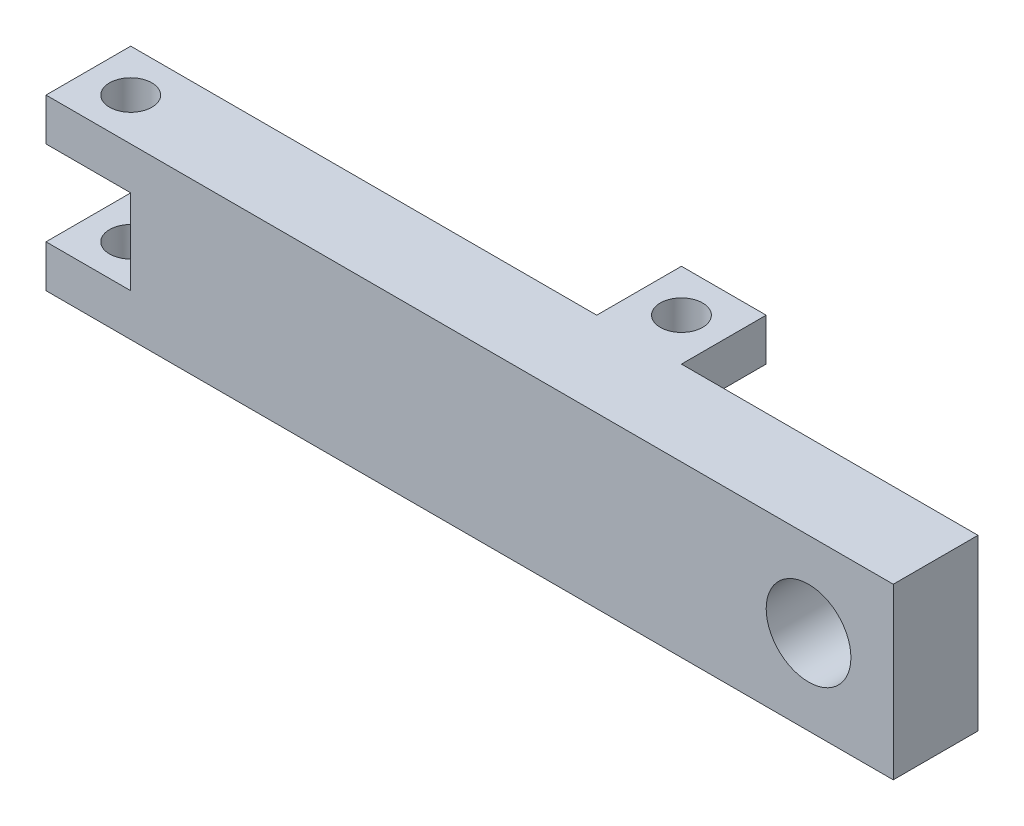
ISO-10303-21;
HEADER;
FILE_DESCRIPTION(('STEP AP214'),'2;1');
FILE_NAME('part.step','',(''),(''),'','','');
FILE_SCHEMA(('AUTOMOTIVE_DESIGN { 1 0 10303 214 1 1 1 1 }'));
ENDSEC;
DATA;
#1=APPLICATION_CONTEXT('core data for automotive mechanical design processes');
#2=APPLICATION_PROTOCOL_DEFINITION('international standard','automotive_design',2000,#1);
#3=PRODUCT_CONTEXT('',#1,'mechanical');
#4=PRODUCT('Part','Part','',(#3));
#5=PRODUCT_RELATED_PRODUCT_CATEGORY('part','',(#4));
#6=PRODUCT_DEFINITION_FORMATION('','',#4);
#7=PRODUCT_DEFINITION_CONTEXT('part definition',#1,'design');
#8=PRODUCT_DEFINITION('design','',#6,#7);
#9=PRODUCT_DEFINITION_SHAPE('','',#8);
#10=(LENGTH_UNIT() NAMED_UNIT(*) SI_UNIT(.MILLI.,.METRE.));
#11=(NAMED_UNIT(*) PLANE_ANGLE_UNIT() SI_UNIT($,.RADIAN.));
#12=(NAMED_UNIT(*) SI_UNIT($,.STERADIAN.) SOLID_ANGLE_UNIT());
#13=UNCERTAINTY_MEASURE_WITH_UNIT(LENGTH_MEASURE(1.E-05),#10,'distance_accuracy_value','');
#14=(GEOMETRIC_REPRESENTATION_CONTEXT(3) GLOBAL_UNCERTAINTY_ASSIGNED_CONTEXT((#13)) GLOBAL_UNIT_ASSIGNED_CONTEXT((#10,
#11,#12)) REPRESENTATION_CONTEXT('',''));
#15=CARTESIAN_POINT('',(0.,0.,0.));
#16=DIRECTION('',(0.,0.,1.));
#17=DIRECTION('',(1.,0.,0.));
#18=AXIS2_PLACEMENT_3D('',#15,#16,#17);
#19=CARTESIAN_POINT('',(-5.,-20.,0.));
#20=DIRECTION('',(-1.,0.,0.));
#21=DIRECTION('',(0.,0.,1.));
#22=AXIS2_PLACEMENT_3D('',#19,#20,#21);
#23=PLANE('',#22);
#24=DIRECTION('',(0.,0.,-1.));
#25=VECTOR('',#24,1.);
#26=CARTESIAN_POINT('',(-5.00000000000001,-15.,9.14213562373095));
#27=LINE('',#26,#25);
#28=CARTESIAN_POINT('',(-5.,-15.,-5.));
#29=VERTEX_POINT('',#28);
#30=CARTESIAN_POINT('',(-5.,-15.,-15.));
#31=VERTEX_POINT('',#30);
#32=EDGE_CURVE('E152',#29,#31,#27,.T.);
#33=ORIENTED_EDGE('',*,*,#32,.T.);
#34=DIRECTION('',(0.,1.,0.));
#35=VECTOR('',#34,1.);
#36=CARTESIAN_POINT('',(-5.,-20.,-15.));
#37=LINE('',#36,#35);
#38=CARTESIAN_POINT('',(-5.,-20.,-15.));
#39=VERTEX_POINT('',#38);
#40=EDGE_CURVE('E184',#39,#31,#37,.T.);
#41=ORIENTED_EDGE('',*,*,#40,.F.);
#42=DIRECTION('',(0.,0.,1.));
#43=VECTOR('',#42,1.);
#44=CARTESIAN_POINT('',(-5.,-20.,0.));
#45=LINE('',#44,#43);
#46=CARTESIAN_POINT('',(-5.,-20.,-5.));
#47=VERTEX_POINT('',#46);
#48=EDGE_CURVE('E178',#39,#47,#45,.T.);
#49=ORIENTED_EDGE('',*,*,#48,.T.);
#50=DIRECTION('',(0.,1.,0.));
#51=VECTOR('',#50,1.);
#52=CARTESIAN_POINT('',(-5.,-20.,-5.));
#53=LINE('',#52,#51);
#54=EDGE_CURVE('E170',#47,#29,#53,.T.);
#55=ORIENTED_EDGE('',*,*,#54,.T.);
#56=EDGE_LOOP('',(#33,#41,#49,#55));
#57=FACE_BOUND('',#56,.T.);
#58=ADVANCED_FACE('F39',(#57),#23,.T.);
#59=CARTESIAN_POINT('',(0.,-20.,-15.));
#60=DIRECTION('',(0.,0.,1.));
#61=DIRECTION('',(1.,0.,0.));
#62=AXIS2_PLACEMENT_3D('',#59,#60,#61);
#63=PLANE('',#62);
#64=ORIENTED_EDGE('',*,*,#40,.T.);
#65=DIRECTION('',(-1.,0.,0.));
#66=VECTOR('',#65,1.);
#67=CARTESIAN_POINT('',(5.,-15.,-15.));
#68=LINE('',#67,#66);
#69=CARTESIAN_POINT('',(5.,-15.,-15.));
#70=VERTEX_POINT('',#69);
#71=EDGE_CURVE('E159',#70,#31,#68,.T.);
#72=ORIENTED_EDGE('',*,*,#71,.F.);
#73=DIRECTION('',(0.,1.,0.));
#74=VECTOR('',#73,1.);
#75=CARTESIAN_POINT('',(5.,-20.,-15.));
#76=LINE('',#75,#74);
#77=CARTESIAN_POINT('',(5.,-20.,-15.));
#78=VERTEX_POINT('',#77);
#79=EDGE_CURVE('E189',#78,#70,#76,.T.);
#80=ORIENTED_EDGE('',*,*,#79,.F.);
#81=DIRECTION('',(1.,0.,0.));
#82=VECTOR('',#81,1.);
#83=CARTESIAN_POINT('',(0.,-20.,-15.));
#84=LINE('',#83,#82);
#85=EDGE_CURVE('E250',#39,#78,#84,.T.);
#86=ORIENTED_EDGE('',*,*,#85,.F.);
#87=EDGE_LOOP('',(#64,#72,#80,#86));
#88=FACE_BOUND('',#87,.T.);
#89=ADVANCED_FACE('F360',(#88),#63,.F.);
#90=CARTESIAN_POINT('',(5.,-20.,0.));
#91=DIRECTION('',(-1.,0.,0.));
#92=DIRECTION('',(0.,0.,1.));
#93=AXIS2_PLACEMENT_3D('',#90,#91,#92);
#94=PLANE('',#93);
#95=ORIENTED_EDGE('',*,*,#79,.T.);
#96=DIRECTION('',(0.,0.,-1.));
#97=VECTOR('',#96,1.);
#98=CARTESIAN_POINT('',(5.,-15.,9.14213562373095));
#99=LINE('',#98,#97);
#100=CARTESIAN_POINT('',(5.,-15.,-5.));
#101=VERTEX_POINT('',#100);
#102=EDGE_CURVE('E208',#101,#70,#99,.T.);
#103=ORIENTED_EDGE('',*,*,#102,.F.);
#104=DIRECTION('',(0.,1.,0.));
#105=VECTOR('',#104,1.);
#106=CARTESIAN_POINT('',(5.,-20.,-5.));
#107=LINE('',#106,#105);
#108=CARTESIAN_POINT('',(5.,-20.,-5.));
#109=VERTEX_POINT('',#108);
#110=EDGE_CURVE('E174',#109,#101,#107,.T.);
#111=ORIENTED_EDGE('',*,*,#110,.F.);
#112=DIRECTION('',(0.,0.,1.));
#113=VECTOR('',#112,1.);
#114=CARTESIAN_POINT('',(5.,-20.,0.));
#115=LINE('',#114,#113);
#116=EDGE_CURVE('E247',#78,#109,#115,.T.);
#117=ORIENTED_EDGE('',*,*,#116,.F.);
#118=EDGE_LOOP('',(#95,#103,#111,#117));
#119=FACE_BOUND('',#118,.T.);
#120=ADVANCED_FACE('F364',(#119),#94,.F.);
#121=CARTESIAN_POINT('',(0.,-20.,-10.));
#122=DIRECTION('',(0.,1.,0.));
#123=DIRECTION('',(0.,0.,1.));
#124=AXIS2_PLACEMENT_3D('',#121,#122,#123);
#125=CYLINDRICAL_SURFACE('',#124,2.5);
#126=CARTESIAN_POINT('',(0.,-15.,-10.));
#127=DIRECTION('',(0.,-1.,0.));
#128=DIRECTION('',(0.,0.,-1.));
#129=AXIS2_PLACEMENT_3D('',#126,#127,#128);
#130=CIRCLE('',#129,2.5);
#131=CARTESIAN_POINT('',(0.,-15.,-12.5));
#132=VERTEX_POINT('',#131);
#133=EDGE_CURVE('E43',#132,#132,#130,.F.);
#134=ORIENTED_EDGE('',*,*,#133,.T.);
#135=EDGE_LOOP('',(#134));
#136=FACE_BOUND('',#135,.T.);
#137=CARTESIAN_POINT('',(0.,-20.,-10.));
#138=DIRECTION('',(0.,1.,0.));
#139=DIRECTION('',(0.,0.,1.));
#140=AXIS2_PLACEMENT_3D('',#137,#138,#139);
#141=CIRCLE('',#140,2.5);
#142=CARTESIAN_POINT('',(0.,-20.,-7.5));
#143=VERTEX_POINT('',#142);
#144=EDGE_CURVE('E198',#143,#143,#141,.T.);
#145=ORIENTED_EDGE('',*,*,#144,.F.);
#146=EDGE_LOOP('',(#145));
#147=FACE_BOUND('',#146,.T.);
#148=ADVANCED_FACE('F382',(#136,#147),#125,.F.);
#149=CARTESIAN_POINT('',(-60.,-20.,0.));
#150=DIRECTION('',(-1.,0.,0.));
#151=DIRECTION('',(0.,0.,1.));
#152=AXIS2_PLACEMENT_3D('',#149,#150,#151);
#153=PLANE('',#152);
#154=DIRECTION('',(0.,0.,1.));
#155=VECTOR('',#154,1.);
#156=CARTESIAN_POINT('',(-60.,-15.,-4.99999999999996));
#157=LINE('',#156,#155);
#158=CARTESIAN_POINT('',(-60.,-15.,-4.99999999999996));
#159=VERTEX_POINT('',#158);
#160=CARTESIAN_POINT('',(-60.,-15.,5.00000000000004));
#161=VERTEX_POINT('',#160);
#162=EDGE_CURVE('E221',#159,#161,#157,.T.);
#163=ORIENTED_EDGE('',*,*,#162,.F.);
#164=DIRECTION('',(0.,1.,0.));
#165=VECTOR('',#164,1.);
#166=CARTESIAN_POINT('',(-60.,-20.,-5.00000000000001));
#167=LINE('',#166,#165);
#168=CARTESIAN_POINT('',(-60.,-20.,-5.00000000000001));
#169=VERTEX_POINT('',#168);
#170=EDGE_CURVE('E182',#169,#159,#167,.T.);
#171=ORIENTED_EDGE('',*,*,#170,.F.);
#172=DIRECTION('',(0.,0.,1.));
#173=VECTOR('',#172,1.);
#174=CARTESIAN_POINT('',(-60.,-20.,0.));
#175=LINE('',#174,#173);
#176=CARTESIAN_POINT('',(-60.,-20.,4.99999999999999));
#177=VERTEX_POINT('',#176);
#178=EDGE_CURVE('E253',#169,#177,#175,.T.);
#179=ORIENTED_EDGE('',*,*,#178,.T.);
#180=DIRECTION('',(0.,1.,0.));
#181=VECTOR('',#180,1.);
#182=CARTESIAN_POINT('',(-60.,-20.,4.99999999999999));
#183=LINE('',#182,#181);
#184=EDGE_CURVE('E48',#177,#161,#183,.T.);
#185=ORIENTED_EDGE('',*,*,#184,.T.);
#186=EDGE_LOOP('',(#163,#171,#179,#185));
#187=FACE_BOUND('',#186,.T.);
#188=ADVANCED_FACE('F296',(#187),#153,.T.);
#189=CARTESIAN_POINT('',(-55.,-20.,0.));
#190=DIRECTION('',(0.,1.,0.));
#191=DIRECTION('',(0.,0.,1.));
#192=AXIS2_PLACEMENT_3D('',#189,#190,#191);
#193=CYLINDRICAL_SURFACE('',#192,2.5);
#194=CARTESIAN_POINT('',(-55.,-15.,0.));
#195=DIRECTION('',(0.,-1.,0.));
#196=DIRECTION('',(0.,0.,-1.));
#197=AXIS2_PLACEMENT_3D('',#194,#195,#196);
#198=CIRCLE('',#197,2.5);
#199=CARTESIAN_POINT('',(-55.,-15.,-2.50000000000001));
#200=VERTEX_POINT('',#199);
#201=EDGE_CURVE('E202',#200,#200,#198,.F.);
#202=ORIENTED_EDGE('',*,*,#201,.T.);
#203=EDGE_LOOP('',(#202));
#204=FACE_BOUND('',#203,.T.);
#205=CARTESIAN_POINT('',(-55.,-20.,0.));
#206=DIRECTION('',(0.,1.,0.));
#207=DIRECTION('',(0.,0.,1.));
#208=AXIS2_PLACEMENT_3D('',#205,#206,#207);
#209=CIRCLE('',#208,2.5);
#210=CARTESIAN_POINT('',(-55.,-20.,2.49999999999999));
#211=VERTEX_POINT('',#210);
#212=EDGE_CURVE('E239',#211,#211,#209,.T.);
#213=ORIENTED_EDGE('',*,*,#212,.F.);
#214=EDGE_LOOP('',(#213));
#215=FACE_BOUND('',#214,.T.);
#216=ADVANCED_FACE('F371',(#204,#215),#193,.F.);
#217=CARTESIAN_POINT('',(40.,-20.,0.));
#218=DIRECTION('',(-1.,0.,0.));
#219=DIRECTION('',(0.,0.,1.));
#220=AXIS2_PLACEMENT_3D('',#217,#218,#219);
#221=PLANE('',#220);
#222=DIRECTION('',(0.,0.,1.));
#223=VECTOR('',#222,1.);
#224=CARTESIAN_POINT('',(40.,0.,0.));
#225=LINE('',#224,#223);
#226=CARTESIAN_POINT('',(40.,0.,-4.99999999999999));
#227=VERTEX_POINT('',#226);
#228=CARTESIAN_POINT('',(40.,0.,5.00000000000001));
#229=VERTEX_POINT('',#228);
#230=EDGE_CURVE('E263',#227,#229,#225,.T.);
#231=ORIENTED_EDGE('',*,*,#230,.T.);
#232=DIRECTION('',(0.,1.,0.));
#233=VECTOR('',#232,1.);
#234=CARTESIAN_POINT('',(40.,-20.,5.00000000000001));
#235=LINE('',#234,#233);
#236=CARTESIAN_POINT('',(40.,-20.,5.00000000000001));
#237=VERTEX_POINT('',#236);
#238=EDGE_CURVE('E11',#237,#229,#235,.T.);
#239=ORIENTED_EDGE('',*,*,#238,.F.);
#240=DIRECTION('',(0.,0.,1.));
#241=VECTOR('',#240,1.);
#242=CARTESIAN_POINT('',(40.,-20.,0.));
#243=LINE('',#242,#241);
#244=CARTESIAN_POINT('',(40.,-20.,-4.99999999999999));
#245=VERTEX_POINT('',#244);
#246=EDGE_CURVE('E242',#245,#237,#243,.T.);
#247=ORIENTED_EDGE('',*,*,#246,.F.);
#248=DIRECTION('',(0.,1.,0.));
#249=VECTOR('',#248,1.);
#250=CARTESIAN_POINT('',(40.,-20.,-4.99999999999999));
#251=LINE('',#250,#249);
#252=EDGE_CURVE('E195',#245,#227,#251,.T.);
#253=ORIENTED_EDGE('',*,*,#252,.T.);
#254=EDGE_LOOP('',(#231,#239,#247,#253));
#255=FACE_BOUND('',#254,.T.);
#256=ADVANCED_FACE('F320',(#255),#221,.F.);
#257=CARTESIAN_POINT('',(0.,-20.,5.));
#258=DIRECTION('',(0.,0.,1.));
#259=DIRECTION('',(1.,0.,0.));
#260=AXIS2_PLACEMENT_3D('',#257,#258,#259);
#261=PLANE('',#260);
#262=CARTESIAN_POINT('',(30.,-10.,5.00000000000001));
#263=DIRECTION('',(0.,0.,1.));
#264=DIRECTION('',(1.,0.,0.));
#265=AXIS2_PLACEMENT_3D('',#262,#263,#264);
#266=CIRCLE('',#265,5.);
#267=CARTESIAN_POINT('',(35.,-10.,5.00000000000001));
#268=VERTEX_POINT('',#267);
#269=EDGE_CURVE('E343',#268,#268,#266,.F.);
#270=ORIENTED_EDGE('',*,*,#269,.T.);
#271=EDGE_LOOP('',(#270));
#272=FACE_BOUND('',#271,.T.);
#273=DIRECTION('',(-1.,0.,0.));
#274=VECTOR('',#273,1.);
#275=CARTESIAN_POINT('',(-50.,-15.,5.00000000000004));
#276=LINE('',#275,#274);
#277=CARTESIAN_POINT('',(-50.,-15.,5.00000000000004));
#278=VERTEX_POINT('',#277);
#279=EDGE_CURVE('E203',#278,#161,#276,.T.);
#280=ORIENTED_EDGE('',*,*,#279,.T.);
#281=ORIENTED_EDGE('',*,*,#184,.F.);
#282=DIRECTION('',(1.,0.,0.));
#283=VECTOR('',#282,1.);
#284=CARTESIAN_POINT('',(0.,-20.,5.));
#285=LINE('',#284,#283);
#286=EDGE_CURVE('E256',#177,#237,#285,.T.);
#287=ORIENTED_EDGE('',*,*,#286,.T.);
#288=ORIENTED_EDGE('',*,*,#238,.T.);
#289=DIRECTION('',(1.,0.,0.));
#290=VECTOR('',#289,1.);
#291=CARTESIAN_POINT('',(0.,0.,5.));
#292=LINE('',#291,#290);
#293=CARTESIAN_POINT('',(-60.,0.,4.99999999999999));
#294=VERTEX_POINT('',#293);
#295=EDGE_CURVE('E281',#294,#229,#292,.T.);
#296=ORIENTED_EDGE('',*,*,#295,.F.);
#297=CARTESIAN_POINT('',(-60.,-5.,5.00000000000004));
#298=VERTEX_POINT('',#297);
#299=EDGE_CURVE('E286',#298,#294,#183,.T.);
#300=ORIENTED_EDGE('',*,*,#299,.F.);
#301=DIRECTION('',(-1.,0.,0.));
#302=VECTOR('',#301,1.);
#303=CARTESIAN_POINT('',(-50.,-5.,5.00000000000004));
#304=LINE('',#303,#302);
#305=CARTESIAN_POINT('',(-50.,-5.,5.00000000000004));
#306=VERTEX_POINT('',#305);
#307=EDGE_CURVE('E228',#306,#298,#304,.T.);
#308=ORIENTED_EDGE('',*,*,#307,.F.);
#309=DIRECTION('',(0.,1.,0.));
#310=VECTOR('',#309,1.);
#311=CARTESIAN_POINT('',(-50.,-5.,5.00000000000004));
#312=LINE('',#311,#310);
#313=EDGE_CURVE('E219',#278,#306,#312,.T.);
#314=ORIENTED_EDGE('',*,*,#313,.F.);
#315=EDGE_LOOP('',(#280,#281,#287,#288,#296,#300,#308,#314));
#316=FACE_BOUND('',#315,.T.);
#317=ADVANCED_FACE('F304',(#272,#316),#261,.T.);
#318=DIRECTION('',(0.,0.,-1.));
#319=VECTOR('',#318,1.);
#320=CARTESIAN_POINT('',(-60.,-5.,-4.99999999999996));
#321=LINE('',#320,#319);
#322=CARTESIAN_POINT('',(-60.,-5.,-4.99999999999996));
#323=VERTEX_POINT('',#322);
#324=EDGE_CURVE('E212',#298,#323,#321,.T.);
#325=ORIENTED_EDGE('',*,*,#324,.F.);
#326=ORIENTED_EDGE('',*,*,#299,.T.);
#327=DIRECTION('',(0.,0.,1.));
#328=VECTOR('',#327,1.);
#329=CARTESIAN_POINT('',(-60.,0.,0.));
#330=LINE('',#329,#328);
#331=CARTESIAN_POINT('',(-60.,0.,-5.00000000000001));
#332=VERTEX_POINT('',#331);
#333=EDGE_CURVE('E278',#332,#294,#330,.T.);
#334=ORIENTED_EDGE('',*,*,#333,.F.);
#335=EDGE_CURVE('E179',#323,#332,#167,.T.);
#336=ORIENTED_EDGE('',*,*,#335,.F.);
#337=EDGE_LOOP('',(#325,#326,#334,#336));
#338=FACE_BOUND('',#337,.T.);
#339=ADVANCED_FACE('F311',(#338),#153,.T.);
#340=CARTESIAN_POINT('',(0.,-20.,-5.));
#341=DIRECTION('',(0.,0.,1.));
#342=DIRECTION('',(1.,0.,0.));
#343=AXIS2_PLACEMENT_3D('',#340,#341,#342);
#344=PLANE('',#343);
#345=CARTESIAN_POINT('',(30.,-10.,-4.99999999999999));
#346=DIRECTION('',(0.,0.,-1.));
#347=DIRECTION('',(-1.,0.,0.));
#348=AXIS2_PLACEMENT_3D('',#345,#346,#347);
#349=CIRCLE('',#348,5.);
#350=CARTESIAN_POINT('',(25.,-10.,-4.99999999999999));
#351=VERTEX_POINT('',#350);
#352=EDGE_CURVE('E341',#351,#351,#349,.T.);
#353=ORIENTED_EDGE('',*,*,#352,.F.);
#354=EDGE_LOOP('',(#353));
#355=FACE_BOUND('',#354,.T.);
#356=ORIENTED_EDGE('',*,*,#170,.T.);
#357=DIRECTION('',(-1.,0.,0.));
#358=VECTOR('',#357,1.);
#359=CARTESIAN_POINT('',(-50.,-15.,-4.99999999999996));
#360=LINE('',#359,#358);
#361=CARTESIAN_POINT('',(-50.,-15.,-4.99999999999996));
#362=VERTEX_POINT('',#361);
#363=EDGE_CURVE('E233',#362,#159,#360,.T.);
#364=ORIENTED_EDGE('',*,*,#363,.F.);
#365=DIRECTION('',(0.,-1.,0.));
#366=VECTOR('',#365,1.);
#367=CARTESIAN_POINT('',(-50.,-5.,-4.99999999999996));
#368=LINE('',#367,#366);
#369=CARTESIAN_POINT('',(-50.,-5.,-5.00000000000001));
#370=VERTEX_POINT('',#369);
#371=EDGE_CURVE('E223',#370,#362,#368,.T.);
#372=ORIENTED_EDGE('',*,*,#371,.F.);
#373=DIRECTION('',(-1.,0.,0.));
#374=VECTOR('',#373,1.);
#375=CARTESIAN_POINT('',(-50.,-5.,-4.99999999999996));
#376=LINE('',#375,#374);
#377=EDGE_CURVE('E235',#370,#323,#376,.T.);
#378=ORIENTED_EDGE('',*,*,#377,.T.);
#379=ORIENTED_EDGE('',*,*,#335,.T.);
#380=DIRECTION('',(1.,0.,0.));
#381=VECTOR('',#380,1.);
#382=CARTESIAN_POINT('',(0.,0.,-5.));
#383=LINE('',#382,#381);
#384=CARTESIAN_POINT('',(-5.,0.,-5.));
#385=VERTEX_POINT('',#384);
#386=EDGE_CURVE('E269',#332,#385,#383,.T.);
#387=ORIENTED_EDGE('',*,*,#386,.T.);
#388=CARTESIAN_POINT('',(-5.,-5.,-5.));
#389=VERTEX_POINT('',#388);
#390=EDGE_CURVE('E180',#389,#385,#53,.T.);
#391=ORIENTED_EDGE('',*,*,#390,.F.);
#392=DIRECTION('',(1.,0.,0.));
#393=VECTOR('',#392,1.);
#394=CARTESIAN_POINT('',(5.,-5.,-5.));
#395=LINE('',#394,#393);
#396=CARTESIAN_POINT('',(5.,-5.,-5.));
#397=VERTEX_POINT('',#396);
#398=EDGE_CURVE('E56',#389,#397,#395,.T.);
#399=ORIENTED_EDGE('',*,*,#398,.T.);
#400=CARTESIAN_POINT('',(5.,0.,-5.));
#401=VERTEX_POINT('',#400);
#402=EDGE_CURVE('E194',#397,#401,#107,.T.);
#403=ORIENTED_EDGE('',*,*,#402,.T.);
#404=EDGE_CURVE('E266',#401,#227,#383,.T.);
#405=ORIENTED_EDGE('',*,*,#404,.T.);
#406=ORIENTED_EDGE('',*,*,#252,.F.);
#407=DIRECTION('',(1.,0.,0.));
#408=VECTOR('',#407,1.);
#409=CARTESIAN_POINT('',(0.,-20.,-5.));
#410=LINE('',#409,#408);
#411=EDGE_CURVE('E245',#109,#245,#410,.T.);
#412=ORIENTED_EDGE('',*,*,#411,.F.);
#413=ORIENTED_EDGE('',*,*,#110,.T.);
#414=DIRECTION('',(-1.,0.,0.));
#415=VECTOR('',#414,1.);
#416=CARTESIAN_POINT('',(5.,-15.,-5.));
#417=LINE('',#416,#415);
#418=EDGE_CURVE('E156',#101,#29,#417,.T.);
#419=ORIENTED_EDGE('',*,*,#418,.T.);
#420=ORIENTED_EDGE('',*,*,#54,.F.);
#421=EDGE_CURVE('E248',#169,#47,#410,.T.);
#422=ORIENTED_EDGE('',*,*,#421,.F.);
#423=EDGE_LOOP('',(#356,#364,#372,#378,#379,#387,#391,#399,#403,#405,#406,#412,#413,#419,#420,#422));
#424=FACE_BOUND('',#423,.T.);
#425=ADVANCED_FACE('F168',(#355,#424),#344,.F.);
#426=DIRECTION('',(0.,0.,-1.));
#427=VECTOR('',#426,1.);
#428=CARTESIAN_POINT('',(-5.00000000000001,-5.,9.14213562373095));
#429=LINE('',#428,#427);
#430=CARTESIAN_POINT('',(-5.,-5.,-15.));
#431=VERTEX_POINT('',#430);
#432=EDGE_CURVE('E163',#389,#431,#429,.T.);
#433=ORIENTED_EDGE('',*,*,#432,.F.);
#434=ORIENTED_EDGE('',*,*,#390,.T.);
#435=DIRECTION('',(0.,0.,1.));
#436=VECTOR('',#435,1.);
#437=CARTESIAN_POINT('',(-5.,0.,0.));
#438=LINE('',#437,#436);
#439=CARTESIAN_POINT('',(-5.,0.,-15.));
#440=VERTEX_POINT('',#439);
#441=EDGE_CURVE('E275',#440,#385,#438,.T.);
#442=ORIENTED_EDGE('',*,*,#441,.F.);
#443=EDGE_CURVE('E188',#431,#440,#37,.T.);
#444=ORIENTED_EDGE('',*,*,#443,.F.);
#445=EDGE_LOOP('',(#433,#434,#442,#444));
#446=FACE_BOUND('',#445,.T.);
#447=ADVANCED_FACE('F336',(#446),#23,.T.);
#448=CARTESIAN_POINT('',(5.,-5.,-15.));
#449=VERTEX_POINT('',#448);
#450=CARTESIAN_POINT('',(5.,0.,-15.));
#451=VERTEX_POINT('',#450);
#452=EDGE_CURVE('E192',#449,#451,#76,.T.);
#453=ORIENTED_EDGE('',*,*,#452,.F.);
#454=DIRECTION('',(1.,0.,0.));
#455=VECTOR('',#454,1.);
#456=CARTESIAN_POINT('',(5.,-5.,-15.));
#457=LINE('',#456,#455);
#458=EDGE_CURVE('E175',#431,#449,#457,.T.);
#459=ORIENTED_EDGE('',*,*,#458,.F.);
#460=ORIENTED_EDGE('',*,*,#443,.T.);
#461=DIRECTION('',(1.,0.,0.));
#462=VECTOR('',#461,1.);
#463=CARTESIAN_POINT('',(0.,0.,-15.));
#464=LINE('',#463,#462);
#465=EDGE_CURVE('E272',#440,#451,#464,.T.);
#466=ORIENTED_EDGE('',*,*,#465,.T.);
#467=EDGE_LOOP('',(#453,#459,#460,#466));
#468=FACE_BOUND('',#467,.T.);
#469=ADVANCED_FACE('F331',(#468),#63,.F.);
#470=ORIENTED_EDGE('',*,*,#402,.F.);
#471=DIRECTION('',(0.,0.,-1.));
#472=VECTOR('',#471,1.);
#473=CARTESIAN_POINT('',(5.,-5.,9.14213562373095));
#474=LINE('',#473,#472);
#475=EDGE_CURVE('E213',#397,#449,#474,.T.);
#476=ORIENTED_EDGE('',*,*,#475,.T.);
#477=ORIENTED_EDGE('',*,*,#452,.T.);
#478=DIRECTION('',(0.,0.,1.));
#479=VECTOR('',#478,1.);
#480=CARTESIAN_POINT('',(5.,0.,0.));
#481=LINE('',#480,#479);
#482=EDGE_CURVE('E268',#451,#401,#481,.T.);
#483=ORIENTED_EDGE('',*,*,#482,.T.);
#484=EDGE_LOOP('',(#470,#476,#477,#483));
#485=FACE_BOUND('',#484,.T.);
#486=ADVANCED_FACE('F327',(#485),#94,.F.);
#487=CARTESIAN_POINT('',(-55.,-5.,0.));
#488=DIRECTION('',(0.,1.,0.));
#489=DIRECTION('',(0.,0.,1.));
#490=AXIS2_PLACEMENT_3D('',#487,#488,#489);
#491=CIRCLE('',#490,2.5);
#492=CARTESIAN_POINT('',(-55.,-5.,2.49999999999999));
#493=VERTEX_POINT('',#492);
#494=EDGE_CURVE('E199',#493,#493,#491,.F.);
#495=ORIENTED_EDGE('',*,*,#494,.T.);
#496=EDGE_LOOP('',(#495));
#497=FACE_BOUND('',#496,.T.);
#498=CARTESIAN_POINT('',(-55.,0.,0.));
#499=DIRECTION('',(0.,1.,0.));
#500=DIRECTION('',(0.,0.,1.));
#501=AXIS2_PLACEMENT_3D('',#498,#499,#500);
#502=CIRCLE('',#501,2.5);
#503=CARTESIAN_POINT('',(-55.,0.,2.49999999999999));
#504=VERTEX_POINT('',#503);
#505=EDGE_CURVE('E205',#504,#504,#502,.T.);
#506=ORIENTED_EDGE('',*,*,#505,.T.);
#507=EDGE_LOOP('',(#506));
#508=FACE_BOUND('',#507,.T.);
#509=ADVANCED_FACE('F41',(#497,#508),#193,.F.);
#510=CARTESIAN_POINT('',(0.,-5.,-10.));
#511=DIRECTION('',(0.,1.,0.));
#512=DIRECTION('',(-1.,0.,0.));
#513=AXIS2_PLACEMENT_3D('',#510,#511,#512);
#514=CIRCLE('',#513,2.5);
#515=CARTESIAN_POINT('',(-2.5,-5.,-10.));
#516=VERTEX_POINT('',#515);
#517=EDGE_CURVE('E206',#516,#516,#514,.F.);
#518=ORIENTED_EDGE('',*,*,#517,.T.);
#519=EDGE_LOOP('',(#518));
#520=FACE_BOUND('',#519,.T.);
#521=CARTESIAN_POINT('',(0.,0.,-10.));
#522=DIRECTION('',(0.,1.,0.));
#523=DIRECTION('',(0.,0.,1.));
#524=AXIS2_PLACEMENT_3D('',#521,#522,#523);
#525=CIRCLE('',#524,2.5);
#526=CARTESIAN_POINT('',(0.,0.,-7.5));
#527=VERTEX_POINT('',#526);
#528=EDGE_CURVE('E243',#527,#527,#525,.T.);
#529=ORIENTED_EDGE('',*,*,#528,.T.);
#530=EDGE_LOOP('',(#529));
#531=FACE_BOUND('',#530,.T.);
#532=ADVANCED_FACE('F385',(#520,#531),#125,.F.);
#533=CARTESIAN_POINT('',(0.,-20.,0.));
#534=DIRECTION('',(0.,1.,0.));
#535=DIRECTION('',(0.,0.,1.));
#536=AXIS2_PLACEMENT_3D('',#533,#534,#535);
#537=PLANE('',#536);
#538=ORIENTED_EDGE('',*,*,#212,.T.);
#539=EDGE_LOOP('',(#538));
#540=FACE_BOUND('',#539,.T.);
#541=ORIENTED_EDGE('',*,*,#246,.T.);
#542=ORIENTED_EDGE('',*,*,#286,.F.);
#543=ORIENTED_EDGE('',*,*,#178,.F.);
#544=ORIENTED_EDGE('',*,*,#421,.T.);
#545=ORIENTED_EDGE('',*,*,#48,.F.);
#546=ORIENTED_EDGE('',*,*,#85,.T.);
#547=ORIENTED_EDGE('',*,*,#116,.T.);
#548=ORIENTED_EDGE('',*,*,#411,.T.);
#549=EDGE_LOOP('',(#541,#542,#543,#544,#545,#546,#547,#548));
#550=FACE_BOUND('',#549,.T.);
#551=ORIENTED_EDGE('',*,*,#144,.T.);
#552=EDGE_LOOP('',(#551));
#553=FACE_BOUND('',#552,.T.);
#554=ADVANCED_FACE('F390',(#540,#550,#553),#537,.F.);
#555=CARTESIAN_POINT('',(0.,0.,0.));
#556=DIRECTION('',(0.,1.,0.));
#557=DIRECTION('',(0.,0.,1.));
#558=AXIS2_PLACEMENT_3D('',#555,#556,#557);
#559=PLANE('',#558);
#560=ORIENTED_EDGE('',*,*,#505,.F.);
#561=EDGE_LOOP('',(#560));
#562=FACE_BOUND('',#561,.T.);
#563=ORIENTED_EDGE('',*,*,#230,.F.);
#564=ORIENTED_EDGE('',*,*,#404,.F.);
#565=ORIENTED_EDGE('',*,*,#482,.F.);
#566=ORIENTED_EDGE('',*,*,#465,.F.);
#567=ORIENTED_EDGE('',*,*,#441,.T.);
#568=ORIENTED_EDGE('',*,*,#386,.F.);
#569=ORIENTED_EDGE('',*,*,#333,.T.);
#570=ORIENTED_EDGE('',*,*,#295,.T.);
#571=EDGE_LOOP('',(#563,#564,#565,#566,#567,#568,#569,#570));
#572=FACE_BOUND('',#571,.T.);
#573=ORIENTED_EDGE('',*,*,#528,.F.);
#574=EDGE_LOOP('',(#573));
#575=FACE_BOUND('',#574,.T.);
#576=ADVANCED_FACE('F315',(#562,#572,#575),#559,.T.);
#577=CARTESIAN_POINT('',(-50.,-15.,-4.99999999999996));
#578=DIRECTION('',(0.,-1.,0.));
#579=DIRECTION('',(0.,0.,-1.));
#580=AXIS2_PLACEMENT_3D('',#577,#578,#579);
#581=PLANE('',#580);
#582=ORIENTED_EDGE('',*,*,#162,.T.);
#583=ORIENTED_EDGE('',*,*,#279,.F.);
#584=DIRECTION('',(0.,0.,1.));
#585=VECTOR('',#584,1.);
#586=CARTESIAN_POINT('',(-50.,-15.,-4.99999999999996));
#587=LINE('',#586,#585);
#588=EDGE_CURVE('E225',#362,#278,#587,.T.);
#589=ORIENTED_EDGE('',*,*,#588,.F.);
#590=ORIENTED_EDGE('',*,*,#363,.T.);
#591=EDGE_LOOP('',(#582,#583,#589,#590));
#592=FACE_BOUND('',#591,.T.);
#593=ORIENTED_EDGE('',*,*,#201,.F.);
#594=EDGE_LOOP('',(#593));
#595=FACE_BOUND('',#594,.T.);
#596=ADVANCED_FACE('F299',(#592,#595),#581,.F.);
#597=CARTESIAN_POINT('',(-50.,-5.,-4.99999999999996));
#598=DIRECTION('',(0.,1.,0.));
#599=DIRECTION('',(0.,0.,1.));
#600=AXIS2_PLACEMENT_3D('',#597,#598,#599);
#601=PLANE('',#600);
#602=ORIENTED_EDGE('',*,*,#324,.T.);
#603=ORIENTED_EDGE('',*,*,#377,.F.);
#604=DIRECTION('',(0.,0.,-1.));
#605=VECTOR('',#604,1.);
#606=CARTESIAN_POINT('',(-50.,-5.,-4.99999999999996));
#607=LINE('',#606,#605);
#608=EDGE_CURVE('E64',#306,#370,#607,.T.);
#609=ORIENTED_EDGE('',*,*,#608,.F.);
#610=ORIENTED_EDGE('',*,*,#307,.T.);
#611=EDGE_LOOP('',(#602,#603,#609,#610));
#612=FACE_BOUND('',#611,.T.);
#613=ORIENTED_EDGE('',*,*,#494,.F.);
#614=EDGE_LOOP('',(#613));
#615=FACE_BOUND('',#614,.T.);
#616=ADVANCED_FACE('F402',(#612,#615),#601,.F.);
#617=CARTESIAN_POINT('',(-50.,0.,0.));
#618=DIRECTION('',(-1.,0.,0.));
#619=DIRECTION('',(0.,0.,1.));
#620=AXIS2_PLACEMENT_3D('',#617,#618,#619);
#621=PLANE('',#620);
#622=ORIENTED_EDGE('',*,*,#313,.T.);
#623=ORIENTED_EDGE('',*,*,#608,.T.);
#624=ORIENTED_EDGE('',*,*,#371,.T.);
#625=ORIENTED_EDGE('',*,*,#588,.T.);
#626=EDGE_LOOP('',(#622,#623,#624,#625));
#627=FACE_BOUND('',#626,.T.);
#628=ADVANCED_FACE('F306',(#627),#621,.T.);
#629=CARTESIAN_POINT('',(5.,-15.,9.14213562373095));
#630=DIRECTION('',(0.,-1.,0.));
#631=DIRECTION('',(0.,0.,-1.));
#632=AXIS2_PLACEMENT_3D('',#629,#630,#631);
#633=PLANE('',#632);
#634=ORIENTED_EDGE('',*,*,#102,.T.);
#635=ORIENTED_EDGE('',*,*,#71,.T.);
#636=ORIENTED_EDGE('',*,*,#32,.F.);
#637=ORIENTED_EDGE('',*,*,#418,.F.);
#638=EDGE_LOOP('',(#634,#635,#636,#637));
#639=FACE_BOUND('',#638,.T.);
#640=ORIENTED_EDGE('',*,*,#133,.F.);
#641=EDGE_LOOP('',(#640));
#642=FACE_BOUND('',#641,.T.);
#643=ADVANCED_FACE('F154',(#639,#642),#633,.F.);
#644=CARTESIAN_POINT('',(5.,-5.,9.14213562373095));
#645=DIRECTION('',(0.,1.,0.));
#646=DIRECTION('',(-1.,0.,0.));
#647=AXIS2_PLACEMENT_3D('',#644,#645,#646);
#648=PLANE('',#647);
#649=ORIENTED_EDGE('',*,*,#432,.T.);
#650=ORIENTED_EDGE('',*,*,#458,.T.);
#651=ORIENTED_EDGE('',*,*,#475,.F.);
#652=ORIENTED_EDGE('',*,*,#398,.F.);
#653=EDGE_LOOP('',(#649,#650,#651,#652));
#654=FACE_BOUND('',#653,.T.);
#655=ORIENTED_EDGE('',*,*,#517,.F.);
#656=EDGE_LOOP('',(#655));
#657=FACE_BOUND('',#656,.T.);
#658=ADVANCED_FACE('F413',(#654,#657),#648,.F.);
#659=CARTESIAN_POINT('',(30.,-10.,5.00100000000006));
#660=DIRECTION('',(0.,0.,-1.));
#661=DIRECTION('',(-1.,0.,0.));
#662=AXIS2_PLACEMENT_3D('',#659,#660,#661);
#663=CYLINDRICAL_SURFACE('',#662,5.);
#664=ORIENTED_EDGE('',*,*,#269,.F.);
#665=EDGE_LOOP('',(#664));
#666=FACE_BOUND('',#665,.T.);
#667=ORIENTED_EDGE('',*,*,#352,.T.);
#668=EDGE_LOOP('',(#667));
#669=FACE_BOUND('',#668,.T.);
#670=ADVANCED_FACE('F349',(#666,#669),#663,.F.);
#671=CLOSED_SHELL('',(#58,#89,#120,#148,#188,#216,#256,#317,#339,#425,#447,#469,#486,#509,#532,
#554,#576,#596,#616,#628,#643,#658,#670));
#672=MANIFOLD_SOLID_BREP('B2',#671);
#673=ADVANCED_BREP_SHAPE_REPRESENTATION('',(#18,#672),#14);
#674=SHAPE_DEFINITION_REPRESENTATION(#9,#673);
ENDSEC;
END-ISO-10303-21;
